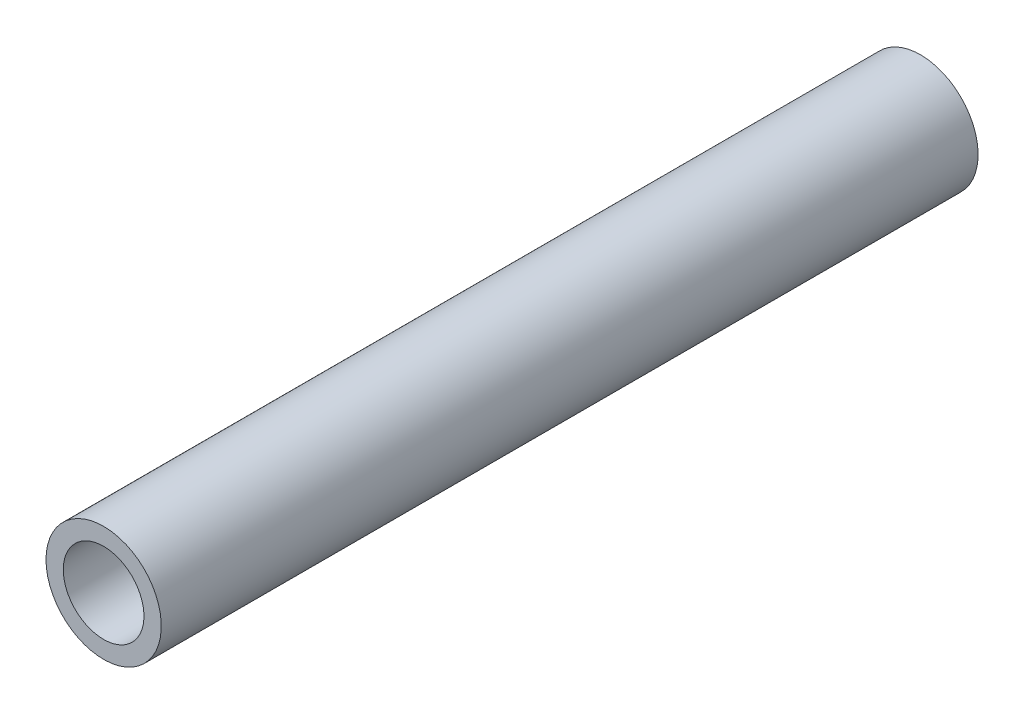
ISO-10303-21;
HEADER;
FILE_DESCRIPTION(('STEP AP214'),'2;1');
FILE_NAME('part.step','',(''),(''),'','','');
FILE_SCHEMA(('AUTOMOTIVE_DESIGN { 1 0 10303 214 1 1 1 1 }'));
ENDSEC;
DATA;
#1=APPLICATION_CONTEXT('core data for automotive mechanical design processes');
#2=APPLICATION_PROTOCOL_DEFINITION('international standard','automotive_design',2000,#1);
#3=PRODUCT_CONTEXT('',#1,'mechanical');
#4=PRODUCT('Part','Part','',(#3));
#5=PRODUCT_RELATED_PRODUCT_CATEGORY('part','',(#4));
#6=PRODUCT_DEFINITION_FORMATION('','',#4);
#7=PRODUCT_DEFINITION_CONTEXT('part definition',#1,'design');
#8=PRODUCT_DEFINITION('design','',#6,#7);
#9=PRODUCT_DEFINITION_SHAPE('','',#8);
#10=(LENGTH_UNIT() NAMED_UNIT(*) SI_UNIT(.MILLI.,.METRE.));
#11=(NAMED_UNIT(*) PLANE_ANGLE_UNIT() SI_UNIT($,.RADIAN.));
#12=(NAMED_UNIT(*) SI_UNIT($,.STERADIAN.) SOLID_ANGLE_UNIT());
#13=UNCERTAINTY_MEASURE_WITH_UNIT(LENGTH_MEASURE(1.E-05),#10,'distance_accuracy_value','');
#14=(GEOMETRIC_REPRESENTATION_CONTEXT(3) GLOBAL_UNCERTAINTY_ASSIGNED_CONTEXT((#13)) GLOBAL_UNIT_ASSIGNED_CONTEXT((#10,
#11,#12)) REPRESENTATION_CONTEXT('',''));
#15=CARTESIAN_POINT('',(0.,0.,0.));
#16=DIRECTION('',(0.,0.,1.));
#17=DIRECTION('',(1.,0.,0.));
#18=AXIS2_PLACEMENT_3D('',#15,#16,#17);
#19=CARTESIAN_POINT('',(0.,0.,56.7));
#20=DIRECTION('',(0.,0.,1.));
#21=DIRECTION('',(1.,0.,0.));
#22=AXIS2_PLACEMENT_3D('',#19,#20,#21);
#23=PLANE('',#22);
#24=CARTESIAN_POINT('',(0.,0.,56.7));
#25=DIRECTION('',(0.,0.,1.));
#26=DIRECTION('',(1.,0.,0.));
#27=AXIS2_PLACEMENT_3D('',#24,#25,#26);
#28=CIRCLE('',#27,4.);
#29=CARTESIAN_POINT('',(-4.,0.,56.7));
#30=VERTEX_POINT('',#29);
#31=EDGE_CURVE('E10',#30,#30,#28,.T.);
#32=ORIENTED_EDGE('',*,*,#31,.T.);
#33=EDGE_LOOP('',(#32));
#34=FACE_BOUND('',#33,.T.);
#35=CARTESIAN_POINT('',(0.,0.,56.7));
#36=DIRECTION('',(0.,0.,1.));
#37=DIRECTION('',(1.,0.,0.));
#38=AXIS2_PLACEMENT_3D('',#35,#36,#37);
#39=CIRCLE('',#38,2.8);
#40=CARTESIAN_POINT('',(-2.8,0.,56.7));
#41=VERTEX_POINT('',#40);
#42=EDGE_CURVE('E50',#41,#41,#39,.T.);
#43=ORIENTED_EDGE('',*,*,#42,.F.);
#44=EDGE_LOOP('',(#43));
#45=FACE_BOUND('',#44,.T.);
#46=ADVANCED_FACE('F37',(#34,#45),#23,.T.);
#47=CARTESIAN_POINT('',(0.,0.,0.));
#48=DIRECTION('',(0.,0.,1.));
#49=DIRECTION('',(1.,0.,0.));
#50=AXIS2_PLACEMENT_3D('',#47,#48,#49);
#51=PLANE('',#50);
#52=CARTESIAN_POINT('',(0.,0.,0.));
#53=DIRECTION('',(0.,0.,1.));
#54=DIRECTION('',(1.,0.,0.));
#55=AXIS2_PLACEMENT_3D('',#52,#53,#54);
#56=CIRCLE('',#55,4.);
#57=CARTESIAN_POINT('',(-4.,0.,0.));
#58=VERTEX_POINT('',#57);
#59=EDGE_CURVE('E41',#58,#58,#56,.T.);
#60=ORIENTED_EDGE('',*,*,#59,.F.);
#61=EDGE_LOOP('',(#60));
#62=FACE_BOUND('',#61,.T.);
#63=CARTESIAN_POINT('',(0.,0.,0.));
#64=DIRECTION('',(0.,0.,1.));
#65=DIRECTION('',(1.,0.,0.));
#66=AXIS2_PLACEMENT_3D('',#63,#64,#65);
#67=CIRCLE('',#66,2.8);
#68=CARTESIAN_POINT('',(-2.8,0.,0.));
#69=VERTEX_POINT('',#68);
#70=EDGE_CURVE('E52',#69,#69,#67,.T.);
#71=ORIENTED_EDGE('',*,*,#70,.T.);
#72=EDGE_LOOP('',(#71));
#73=FACE_BOUND('',#72,.T.);
#74=ADVANCED_FACE('F64',(#62,#73),#51,.F.);
#75=CARTESIAN_POINT('',(0.,0.,56.7));
#76=DIRECTION('',(0.,0.,-1.));
#77=DIRECTION('',(-1.,0.,0.));
#78=AXIS2_PLACEMENT_3D('',#75,#76,#77);
#79=CYLINDRICAL_SURFACE('',#78,4.);
#80=CARTESIAN_POINT('',(-4.,0.,56.7));
#81=CARTESIAN_POINT('',(-4.,0.,56.109375));
#82=CARTESIAN_POINT('',(-4.,0.,55.51875));
#83=CARTESIAN_POINT('',(-4.,0.,54.3375));
#84=CARTESIAN_POINT('',(-4.,0.,53.746875));
#85=CARTESIAN_POINT('',(-4.,0.,52.565625));
#86=CARTESIAN_POINT('',(-4.,0.,51.975));
#87=CARTESIAN_POINT('',(-4.,0.,50.79375));
#88=CARTESIAN_POINT('',(-4.,0.,50.203125));
#89=CARTESIAN_POINT('',(-4.,0.,49.021875));
#90=CARTESIAN_POINT('',(-4.,0.,48.43125));
#91=CARTESIAN_POINT('',(-4.,0.,47.25));
#92=CARTESIAN_POINT('',(-4.,0.,46.659375));
#93=CARTESIAN_POINT('',(-4.,0.,45.478125));
#94=CARTESIAN_POINT('',(-4.,0.,44.8875));
#95=CARTESIAN_POINT('',(-4.,0.,43.70625));
#96=CARTESIAN_POINT('',(-4.,0.,43.115625));
#97=CARTESIAN_POINT('',(-4.,0.,41.934375));
#98=CARTESIAN_POINT('',(-4.,0.,41.34375));
#99=CARTESIAN_POINT('',(-4.,0.,40.1625));
#100=CARTESIAN_POINT('',(-4.,0.,39.571875));
#101=CARTESIAN_POINT('',(-4.,0.,38.390625));
#102=CARTESIAN_POINT('',(-4.,0.,37.8));
#103=CARTESIAN_POINT('',(-4.,0.,36.61875));
#104=CARTESIAN_POINT('',(-4.,0.,36.028125));
#105=CARTESIAN_POINT('',(-4.,0.,34.846875));
#106=CARTESIAN_POINT('',(-4.,0.,34.25625));
#107=CARTESIAN_POINT('',(-4.,0.,33.075));
#108=CARTESIAN_POINT('',(-4.,0.,32.484375));
#109=CARTESIAN_POINT('',(-4.,0.,31.303125));
#110=CARTESIAN_POINT('',(-4.,0.,30.7125));
#111=CARTESIAN_POINT('',(-4.,0.,29.53125));
#112=CARTESIAN_POINT('',(-4.,0.,28.940625));
#113=CARTESIAN_POINT('',(-4.,0.,27.759375));
#114=CARTESIAN_POINT('',(-4.,0.,27.16875));
#115=CARTESIAN_POINT('',(-4.,0.,25.9875));
#116=CARTESIAN_POINT('',(-4.,0.,25.396875));
#117=CARTESIAN_POINT('',(-4.,0.,24.215625));
#118=CARTESIAN_POINT('',(-4.,0.,23.625));
#119=CARTESIAN_POINT('',(-4.,0.,22.44375));
#120=CARTESIAN_POINT('',(-4.,0.,21.853125));
#121=CARTESIAN_POINT('',(-4.,0.,20.671875));
#122=CARTESIAN_POINT('',(-4.,0.,20.08125));
#123=CARTESIAN_POINT('',(-4.,0.,18.9));
#124=CARTESIAN_POINT('',(-4.,0.,18.309375));
#125=CARTESIAN_POINT('',(-4.,0.,17.128125));
#126=CARTESIAN_POINT('',(-4.,0.,16.5375));
#127=CARTESIAN_POINT('',(-4.,0.,15.35625));
#128=CARTESIAN_POINT('',(-4.,0.,14.765625));
#129=CARTESIAN_POINT('',(-4.,0.,13.584375));
#130=CARTESIAN_POINT('',(-4.,0.,12.99375));
#131=CARTESIAN_POINT('',(-4.,0.,11.8125));
#132=CARTESIAN_POINT('',(-4.,0.,11.221875));
#133=CARTESIAN_POINT('',(-4.,0.,10.040625));
#134=CARTESIAN_POINT('',(-4.,0.,9.45));
#135=CARTESIAN_POINT('',(-4.,0.,8.26875));
#136=CARTESIAN_POINT('',(-4.,0.,7.678125));
#137=CARTESIAN_POINT('',(-4.,0.,6.49687499999999));
#138=CARTESIAN_POINT('',(-4.,0.,5.90624999999999));
#139=CARTESIAN_POINT('',(-4.,0.,4.72499999999999));
#140=CARTESIAN_POINT('',(-4.,0.,4.13437499999999));
#141=CARTESIAN_POINT('',(-4.,0.,2.95312499999999));
#142=CARTESIAN_POINT('',(-4.,0.,2.36249999999999));
#143=CARTESIAN_POINT('',(-4.,0.,1.18124999999999));
#144=CARTESIAN_POINT('',(-4.,0.,0.590624999999993));
#145=CARTESIAN_POINT('',(-4.,0.,0.));
#146=B_SPLINE_CURVE_WITH_KNOTS('',3,(#80,#81,#82,#83,#84,#85,#86,#87,#88,#89,#90,#91,#92,#93,
#94,#95,#96,#97,#98,#99,#100,#101,#102,#103,#104,#105,#106,#107,#108,#109,#110,#111,#112,#113,
#114,#115,#116,#117,#118,#119,#120,#121,#122,#123,#124,#125,#126,#127,#128,#129,#130,#131,#132,
#133,#134,#135,#136,#137,#138,#139,#140,#141,#142,#143,#144,#145),.UNSPECIFIED.,.F.,.F.,(4,2,2,
2,2,2,2,2,2,2,2,2,2,2,2,2,2,2,2,2,2,2,2,2,2,2,2,2,2,2,2,2,4),(0.,1.771875,3.54375,5.315625,
7.0875,8.859375,10.63125,12.403125,14.175,15.946875,17.71875,19.490625,21.2625,23.034375,
24.80625,26.578125,28.35,30.121875,31.89375,33.665625,35.4375,37.209375,38.98125,40.753125,
42.525,44.296875,46.06875,47.840625,49.6125,51.384375,53.15625,54.928125,56.7),.UNSPECIFIED.);
#147=EDGE_CURVE('BSEAM39',#30,#58,#146,.T.);
#148=ORIENTED_EDGE('',*,*,#31,.F.);
#149=ORIENTED_EDGE('',*,*,#59,.T.);
#150=ORIENTED_EDGE('',*,*,#147,.T.);
#151=ORIENTED_EDGE('',*,*,#147,.F.);
#152=EDGE_LOOP('',(#148,#150,#149,#151));
#153=FACE_BOUND('',#152,.T.);
#154=ADVANCED_FACE('F39',(#153),#79,.T.);
#155=CARTESIAN_POINT('',(0.,0.,56.7));
#156=DIRECTION('',(0.,0.,-1.));
#157=DIRECTION('',(-1.,0.,0.));
#158=AXIS2_PLACEMENT_3D('',#155,#156,#157);
#159=CYLINDRICAL_SURFACE('',#158,2.8);
#160=CARTESIAN_POINT('',(-2.8,0.,56.7));
#161=CARTESIAN_POINT('',(-2.8,0.,56.109375));
#162=CARTESIAN_POINT('',(-2.8,0.,55.51875));
#163=CARTESIAN_POINT('',(-2.8,0.,54.3375));
#164=CARTESIAN_POINT('',(-2.8,0.,53.746875));
#165=CARTESIAN_POINT('',(-2.8,0.,52.565625));
#166=CARTESIAN_POINT('',(-2.8,0.,51.975));
#167=CARTESIAN_POINT('',(-2.8,0.,50.79375));
#168=CARTESIAN_POINT('',(-2.8,0.,50.203125));
#169=CARTESIAN_POINT('',(-2.8,0.,49.021875));
#170=CARTESIAN_POINT('',(-2.8,0.,48.43125));
#171=CARTESIAN_POINT('',(-2.8,0.,47.25));
#172=CARTESIAN_POINT('',(-2.8,0.,46.659375));
#173=CARTESIAN_POINT('',(-2.8,0.,45.478125));
#174=CARTESIAN_POINT('',(-2.8,0.,44.8875));
#175=CARTESIAN_POINT('',(-2.8,0.,43.70625));
#176=CARTESIAN_POINT('',(-2.8,0.,43.115625));
#177=CARTESIAN_POINT('',(-2.8,0.,41.934375));
#178=CARTESIAN_POINT('',(-2.8,0.,41.34375));
#179=CARTESIAN_POINT('',(-2.8,0.,40.1625));
#180=CARTESIAN_POINT('',(-2.8,0.,39.571875));
#181=CARTESIAN_POINT('',(-2.8,0.,38.390625));
#182=CARTESIAN_POINT('',(-2.8,0.,37.8));
#183=CARTESIAN_POINT('',(-2.8,0.,36.61875));
#184=CARTESIAN_POINT('',(-2.8,0.,36.028125));
#185=CARTESIAN_POINT('',(-2.8,0.,34.846875));
#186=CARTESIAN_POINT('',(-2.8,0.,34.25625));
#187=CARTESIAN_POINT('',(-2.8,0.,33.075));
#188=CARTESIAN_POINT('',(-2.8,0.,32.484375));
#189=CARTESIAN_POINT('',(-2.8,0.,31.303125));
#190=CARTESIAN_POINT('',(-2.8,0.,30.7125));
#191=CARTESIAN_POINT('',(-2.8,0.,29.53125));
#192=CARTESIAN_POINT('',(-2.8,0.,28.940625));
#193=CARTESIAN_POINT('',(-2.8,0.,27.759375));
#194=CARTESIAN_POINT('',(-2.8,0.,27.16875));
#195=CARTESIAN_POINT('',(-2.8,0.,25.9875));
#196=CARTESIAN_POINT('',(-2.8,0.,25.396875));
#197=CARTESIAN_POINT('',(-2.8,0.,24.215625));
#198=CARTESIAN_POINT('',(-2.8,0.,23.625));
#199=CARTESIAN_POINT('',(-2.8,0.,22.44375));
#200=CARTESIAN_POINT('',(-2.8,0.,21.853125));
#201=CARTESIAN_POINT('',(-2.8,0.,20.671875));
#202=CARTESIAN_POINT('',(-2.8,0.,20.08125));
#203=CARTESIAN_POINT('',(-2.8,0.,18.9));
#204=CARTESIAN_POINT('',(-2.8,0.,18.309375));
#205=CARTESIAN_POINT('',(-2.8,0.,17.128125));
#206=CARTESIAN_POINT('',(-2.8,0.,16.5375));
#207=CARTESIAN_POINT('',(-2.8,0.,15.35625));
#208=CARTESIAN_POINT('',(-2.8,0.,14.765625));
#209=CARTESIAN_POINT('',(-2.8,0.,13.584375));
#210=CARTESIAN_POINT('',(-2.8,0.,12.99375));
#211=CARTESIAN_POINT('',(-2.8,0.,11.8125));
#212=CARTESIAN_POINT('',(-2.8,0.,11.221875));
#213=CARTESIAN_POINT('',(-2.8,0.,10.040625));
#214=CARTESIAN_POINT('',(-2.8,0.,9.45));
#215=CARTESIAN_POINT('',(-2.8,0.,8.26875));
#216=CARTESIAN_POINT('',(-2.8,0.,7.678125));
#217=CARTESIAN_POINT('',(-2.8,0.,6.496875));
#218=CARTESIAN_POINT('',(-2.8,0.,5.90625));
#219=CARTESIAN_POINT('',(-2.8,0.,4.725));
#220=CARTESIAN_POINT('',(-2.8,0.,4.13437499999999));
#221=CARTESIAN_POINT('',(-2.8,0.,2.95312499999999));
#222=CARTESIAN_POINT('',(-2.8,0.,2.36249999999999));
#223=CARTESIAN_POINT('',(-2.8,0.,1.18124999999999));
#224=CARTESIAN_POINT('',(-2.8,0.,0.590624999999993));
#225=CARTESIAN_POINT('',(-2.8,0.,0.));
#226=B_SPLINE_CURVE_WITH_KNOTS('',3,(#160,#161,#162,#163,#164,#165,#166,#167,#168,#169,#170,
#171,#172,#173,#174,#175,#176,#177,#178,#179,#180,#181,#182,#183,#184,#185,#186,#187,#188,#189,
#190,#191,#192,#193,#194,#195,#196,#197,#198,#199,#200,#201,#202,#203,#204,#205,#206,#207,#208,
#209,#210,#211,#212,#213,#214,#215,#216,#217,#218,#219,#220,#221,#222,#223,#224,#225),
.UNSPECIFIED.,.F.,.F.,(4,2,2,2,2,2,2,2,2,2,2,2,2,2,2,2,2,2,2,2,2,2,2,2,2,2,2,2,2,2,2,2,4),(0.,
1.77187500000001,3.54375000000001,5.315625,7.0875,8.859375,10.63125,12.403125,14.175,15.946875,
17.71875,19.490625,21.2625,23.034375,24.80625,26.578125,28.35,30.121875,31.89375,33.665625,
35.4375,37.209375,38.98125,40.753125,42.525,44.296875,46.06875,47.840625,49.6125,51.384375,
53.15625,54.928125,56.7),.UNSPECIFIED.);
#227=EDGE_CURVE('BSEAM60',#41,#69,#226,.T.);
#228=ORIENTED_EDGE('',*,*,#42,.T.);
#229=ORIENTED_EDGE('',*,*,#70,.F.);
#230=ORIENTED_EDGE('',*,*,#227,.T.);
#231=ORIENTED_EDGE('',*,*,#227,.F.);
#232=EDGE_LOOP('',(#228,#230,#229,#231));
#233=FACE_BOUND('',#232,.T.);
#234=ADVANCED_FACE('F60',(#233),#159,.F.);
#235=CLOSED_SHELL('',(#46,#74,#154,#234));
#236=MANIFOLD_SOLID_BREP('B2',#235);
#237=ADVANCED_BREP_SHAPE_REPRESENTATION('',(#18,#236),#14);
#238=SHAPE_DEFINITION_REPRESENTATION(#9,#237);
ENDSEC;
END-ISO-10303-21;
